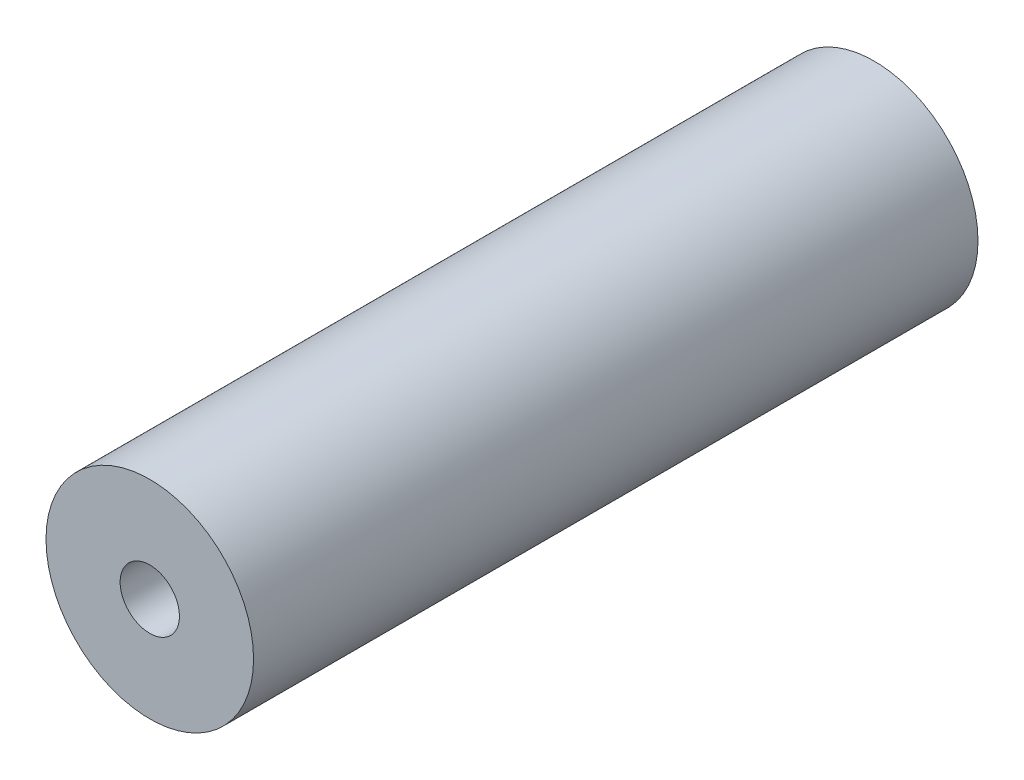
ISO-10303-21;
HEADER;
FILE_DESCRIPTION(('STEP AP214'),'2;1');
FILE_NAME('part.step','',(''),(''),'','','');
FILE_SCHEMA(('AUTOMOTIVE_DESIGN { 1 0 10303 214 1 1 1 1 }'));
ENDSEC;
DATA;
#1=APPLICATION_CONTEXT('core data for automotive mechanical design processes');
#2=APPLICATION_PROTOCOL_DEFINITION('international standard','automotive_design',2000,#1);
#3=PRODUCT_CONTEXT('',#1,'mechanical');
#4=PRODUCT('Part','Part','',(#3));
#5=PRODUCT_RELATED_PRODUCT_CATEGORY('part','',(#4));
#6=PRODUCT_DEFINITION_FORMATION('','',#4);
#7=PRODUCT_DEFINITION_CONTEXT('part definition',#1,'design');
#8=PRODUCT_DEFINITION('design','',#6,#7);
#9=PRODUCT_DEFINITION_SHAPE('','',#8);
#10=(LENGTH_UNIT() NAMED_UNIT(*) SI_UNIT(.MILLI.,.METRE.));
#11=(NAMED_UNIT(*) PLANE_ANGLE_UNIT() SI_UNIT($,.RADIAN.));
#12=(NAMED_UNIT(*) SI_UNIT($,.STERADIAN.) SOLID_ANGLE_UNIT());
#13=UNCERTAINTY_MEASURE_WITH_UNIT(LENGTH_MEASURE(1.E-05),#10,'distance_accuracy_value','');
#14=(GEOMETRIC_REPRESENTATION_CONTEXT(3) GLOBAL_UNCERTAINTY_ASSIGNED_CONTEXT((#13)) GLOBAL_UNIT_ASSIGNED_CONTEXT((#10,
#11,#12)) REPRESENTATION_CONTEXT('',''));
#15=CARTESIAN_POINT('',(0.,0.,0.));
#16=DIRECTION('',(0.,0.,1.));
#17=DIRECTION('',(1.,0.,0.));
#18=AXIS2_PLACEMENT_3D('',#15,#16,#17);
#19=CARTESIAN_POINT('',(0.,0.,77.5716));
#20=DIRECTION('',(0.,0.,1.));
#21=DIRECTION('',(1.,0.,0.));
#22=AXIS2_PLACEMENT_3D('',#19,#20,#21);
#23=PLANE('',#22);
#24=CARTESIAN_POINT('',(0.,0.,77.5716));
#25=DIRECTION('',(0.,0.,1.));
#26=DIRECTION('',(1.,0.,0.));
#27=AXIS2_PLACEMENT_3D('',#24,#25,#26);
#28=CIRCLE('',#27,11.1125);
#29=CARTESIAN_POINT('',(11.1125,0.,77.5716));
#30=VERTEX_POINT('',#29);
#31=EDGE_CURVE('E10',#30,#30,#28,.T.);
#32=ORIENTED_EDGE('',*,*,#31,.T.);
#33=EDGE_LOOP('',(#32));
#34=FACE_BOUND('',#33,.T.);
#35=CARTESIAN_POINT('',(0.,0.,77.5716));
#36=DIRECTION('',(0.,0.,1.));
#37=DIRECTION('',(1.,0.,0.));
#38=AXIS2_PLACEMENT_3D('',#35,#36,#37);
#39=CIRCLE('',#38,3.175);
#40=CARTESIAN_POINT('',(3.175,0.,77.5716));
#41=VERTEX_POINT('',#40);
#42=EDGE_CURVE('E42',#41,#41,#39,.T.);
#43=ORIENTED_EDGE('',*,*,#42,.F.);
#44=EDGE_LOOP('',(#43));
#45=FACE_BOUND('',#44,.T.);
#46=ADVANCED_FACE('F31',(#34,#45),#23,.T.);
#47=CARTESIAN_POINT('',(0.,0.,0.));
#48=DIRECTION('',(0.,0.,1.));
#49=DIRECTION('',(1.,0.,0.));
#50=AXIS2_PLACEMENT_3D('',#47,#48,#49);
#51=PLANE('',#50);
#52=CARTESIAN_POINT('',(0.,0.,0.));
#53=DIRECTION('',(0.,0.,1.));
#54=DIRECTION('',(1.,0.,0.));
#55=AXIS2_PLACEMENT_3D('',#52,#53,#54);
#56=CIRCLE('',#55,11.1125);
#57=CARTESIAN_POINT('',(11.1125,0.,0.));
#58=VERTEX_POINT('',#57);
#59=EDGE_CURVE('E35',#58,#58,#56,.T.);
#60=ORIENTED_EDGE('',*,*,#59,.F.);
#61=EDGE_LOOP('',(#60));
#62=FACE_BOUND('',#61,.T.);
#63=CARTESIAN_POINT('',(0.,0.,0.));
#64=DIRECTION('',(0.,0.,1.));
#65=DIRECTION('',(1.,0.,0.));
#66=AXIS2_PLACEMENT_3D('',#63,#64,#65);
#67=CIRCLE('',#66,3.175);
#68=CARTESIAN_POINT('',(3.175,0.,0.));
#69=VERTEX_POINT('',#68);
#70=EDGE_CURVE('E44',#69,#69,#67,.T.);
#71=ORIENTED_EDGE('',*,*,#70,.T.);
#72=EDGE_LOOP('',(#71));
#73=FACE_BOUND('',#72,.T.);
#74=ADVANCED_FACE('F54',(#62,#73),#51,.F.);
#75=CARTESIAN_POINT('',(0.,0.,77.5716));
#76=DIRECTION('',(0.,0.,-1.));
#77=DIRECTION('',(-1.,0.,0.));
#78=AXIS2_PLACEMENT_3D('',#75,#76,#77);
#79=CYLINDRICAL_SURFACE('',#78,11.1125);
#80=ORIENTED_EDGE('',*,*,#31,.F.);
#81=EDGE_LOOP('',(#80));
#82=FACE_BOUND('',#81,.T.);
#83=ORIENTED_EDGE('',*,*,#59,.T.);
#84=EDGE_LOOP('',(#83));
#85=FACE_BOUND('',#84,.T.);
#86=ADVANCED_FACE('F33',(#82,#85),#79,.T.);
#87=CARTESIAN_POINT('',(0.,0.,77.5716));
#88=DIRECTION('',(0.,0.,-1.));
#89=DIRECTION('',(-1.,0.,0.));
#90=AXIS2_PLACEMENT_3D('',#87,#88,#89);
#91=CYLINDRICAL_SURFACE('',#90,3.175);
#92=ORIENTED_EDGE('',*,*,#42,.T.);
#93=EDGE_LOOP('',(#92));
#94=FACE_BOUND('',#93,.T.);
#95=ORIENTED_EDGE('',*,*,#70,.F.);
#96=EDGE_LOOP('',(#95));
#97=FACE_BOUND('',#96,.T.);
#98=ADVANCED_FACE('F50',(#94,#97),#91,.F.);
#99=CLOSED_SHELL('',(#46,#74,#86,#98));
#100=MANIFOLD_SOLID_BREP('B2',#99);
#101=ADVANCED_BREP_SHAPE_REPRESENTATION('',(#18,#100),#14);
#102=SHAPE_DEFINITION_REPRESENTATION(#9,#101);
ENDSEC;
END-ISO-10303-21;
